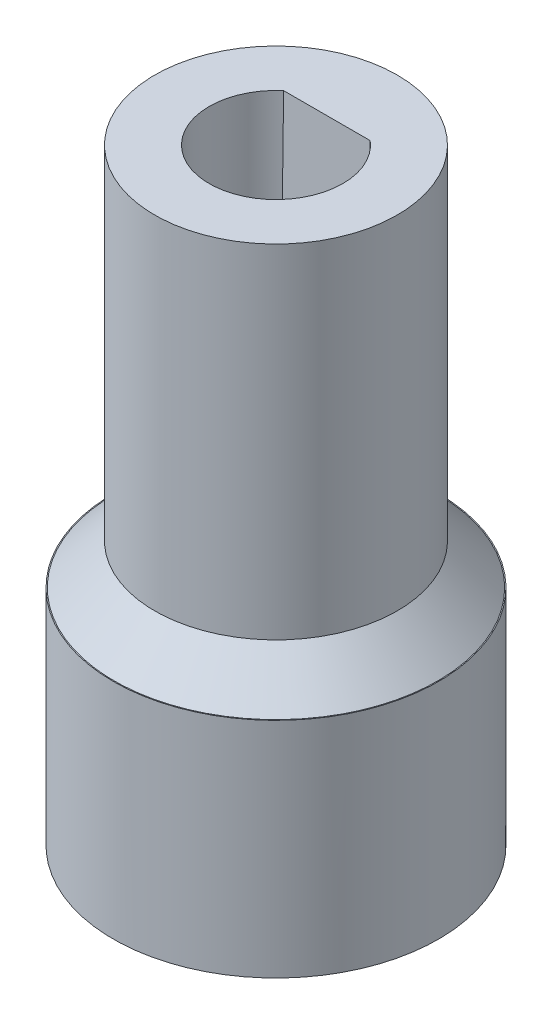
ISO-10303-21;
HEADER;
FILE_DESCRIPTION(('STEP AP214'),'2;1');
FILE_NAME('part.step','',(''),(''),'','','');
FILE_SCHEMA(('AUTOMOTIVE_DESIGN { 1 0 10303 214 1 1 1 1 }'));
ENDSEC;
DATA;
#1=APPLICATION_CONTEXT('core data for automotive mechanical design processes');
#2=APPLICATION_PROTOCOL_DEFINITION('international standard','automotive_design',2000,#1);
#3=PRODUCT_CONTEXT('',#1,'mechanical');
#4=PRODUCT('Part','Part','',(#3));
#5=PRODUCT_RELATED_PRODUCT_CATEGORY('part','',(#4));
#6=PRODUCT_DEFINITION_FORMATION('','',#4);
#7=PRODUCT_DEFINITION_CONTEXT('part definition',#1,'design');
#8=PRODUCT_DEFINITION('design','',#6,#7);
#9=PRODUCT_DEFINITION_SHAPE('','',#8);
#10=(LENGTH_UNIT() NAMED_UNIT(*) SI_UNIT(.MILLI.,.METRE.));
#11=(NAMED_UNIT(*) PLANE_ANGLE_UNIT() SI_UNIT($,.RADIAN.));
#12=(NAMED_UNIT(*) SI_UNIT($,.STERADIAN.) SOLID_ANGLE_UNIT());
#13=UNCERTAINTY_MEASURE_WITH_UNIT(LENGTH_MEASURE(1.E-05),#10,'distance_accuracy_value','');
#14=(GEOMETRIC_REPRESENTATION_CONTEXT(3) GLOBAL_UNCERTAINTY_ASSIGNED_CONTEXT((#13)) GLOBAL_UNIT_ASSIGNED_CONTEXT((#10,
#11,#12)) REPRESENTATION_CONTEXT('',''));
#15=CARTESIAN_POINT('',(0.,0.,0.));
#16=DIRECTION('',(0.,0.,1.));
#17=DIRECTION('',(1.,0.,0.));
#18=AXIS2_PLACEMENT_3D('',#15,#16,#17);
#19=CARTESIAN_POINT('',(0.,38.1,0.));
#20=DIRECTION('',(0.,-1.,0.));
#21=DIRECTION('',(0.,0.,-1.));
#22=AXIS2_PLACEMENT_3D('',#19,#20,#21);
#23=CYLINDRICAL_SURFACE('',#22,7.62);
#24=CARTESIAN_POINT('',(0.,16.5599999,0.));
#25=DIRECTION('',(0.,1.,0.));
#26=DIRECTION('',(0.,0.,1.));
#27=AXIS2_PLACEMENT_3D('',#24,#25,#26);
#28=CIRCLE('',#27,7.62);
#29=CARTESIAN_POINT('',(0.,16.5599999,-7.62));
#30=VERTEX_POINT('',#29);
#31=EDGE_CURVE('E12',#30,#30,#28,.T.);
#32=CARTESIAN_POINT('',(0.,38.1,0.));
#33=DIRECTION('',(0.,1.,0.));
#34=DIRECTION('',(0.,0.,1.));
#35=AXIS2_PLACEMENT_3D('',#32,#33,#34);
#36=CIRCLE('',#35,7.62);
#37=CARTESIAN_POINT('',(0.,38.1,-7.62));
#38=VERTEX_POINT('',#37);
#39=EDGE_CURVE('E143',#38,#38,#36,.T.);
#40=CARTESIAN_POINT('',(0.,16.5599999,-7.62));
#41=CARTESIAN_POINT('',(0.,16.7843749010416,-7.62));
#42=CARTESIAN_POINT('',(0.,17.0087499020833,-7.62));
#43=CARTESIAN_POINT('',(0.,17.4574999041666,-7.62));
#44=CARTESIAN_POINT('',(0.,17.6818749052083,-7.62));
#45=CARTESIAN_POINT('',(0.,18.1306249072916,-7.62));
#46=CARTESIAN_POINT('',(0.,18.3549999083333,-7.62));
#47=CARTESIAN_POINT('',(0.,18.8037499104166,-7.62));
#48=CARTESIAN_POINT('',(0.,19.0281249114583,-7.62));
#49=CARTESIAN_POINT('',(0.,19.4768749135416,-7.62));
#50=CARTESIAN_POINT('',(0.,19.7012499145833,-7.62));
#51=CARTESIAN_POINT('',(0.,20.1499999166667,-7.62));
#52=CARTESIAN_POINT('',(0.,20.3743749177083,-7.62));
#53=CARTESIAN_POINT('',(0.,20.8231249197917,-7.62));
#54=CARTESIAN_POINT('',(0.,21.0474999208333,-7.62));
#55=CARTESIAN_POINT('',(0.,21.4962499229167,-7.62));
#56=CARTESIAN_POINT('',(0.,21.7206249239583,-7.62));
#57=CARTESIAN_POINT('',(0.,22.1693749260417,-7.62));
#58=CARTESIAN_POINT('',(0.,22.3937499270833,-7.62));
#59=CARTESIAN_POINT('',(0.,22.8424999291667,-7.62));
#60=CARTESIAN_POINT('',(0.,23.0668749302083,-7.62));
#61=CARTESIAN_POINT('',(0.,23.5156249322917,-7.62));
#62=CARTESIAN_POINT('',(0.,23.7399999333333,-7.62));
#63=CARTESIAN_POINT('',(0.,24.1887499354167,-7.62));
#64=CARTESIAN_POINT('',(0.,24.4131249364583,-7.62));
#65=CARTESIAN_POINT('',(0.,24.8618749385417,-7.62));
#66=CARTESIAN_POINT('',(0.,25.0862499395833,-7.62));
#67=CARTESIAN_POINT('',(0.,25.5349999416667,-7.62));
#68=CARTESIAN_POINT('',(0.,25.7593749427083,-7.62));
#69=CARTESIAN_POINT('',(0.,26.2081249447917,-7.62));
#70=CARTESIAN_POINT('',(0.,26.4324999458333,-7.62));
#71=CARTESIAN_POINT('',(0.,26.8812499479167,-7.62));
#72=CARTESIAN_POINT('',(0.,27.1056249489583,-7.62));
#73=CARTESIAN_POINT('',(0.,27.5543749510417,-7.62));
#74=CARTESIAN_POINT('',(0.,27.7787499520833,-7.62));
#75=CARTESIAN_POINT('',(0.,28.2274999541667,-7.62));
#76=CARTESIAN_POINT('',(0.,28.4518749552083,-7.62));
#77=CARTESIAN_POINT('',(0.,28.9006249572917,-7.62));
#78=CARTESIAN_POINT('',(0.,29.1249999583333,-7.62));
#79=CARTESIAN_POINT('',(0.,29.5737499604167,-7.62));
#80=CARTESIAN_POINT('',(0.,29.7981249614583,-7.62));
#81=CARTESIAN_POINT('',(0.,30.2468749635417,-7.62));
#82=CARTESIAN_POINT('',(0.,30.4712499645833,-7.62));
#83=CARTESIAN_POINT('',(0.,30.9199999666667,-7.62));
#84=CARTESIAN_POINT('',(0.,31.1443749677083,-7.62));
#85=CARTESIAN_POINT('',(0.,31.5931249697917,-7.62));
#86=CARTESIAN_POINT('',(0.,31.8174999708333,-7.62));
#87=CARTESIAN_POINT('',(0.,32.2662499729167,-7.62));
#88=CARTESIAN_POINT('',(0.,32.4906249739583,-7.62));
#89=CARTESIAN_POINT('',(0.,32.9393749760417,-7.62));
#90=CARTESIAN_POINT('',(0.,33.1637499770833,-7.62));
#91=CARTESIAN_POINT('',(0.,33.6124999791667,-7.62));
#92=CARTESIAN_POINT('',(0.,33.8368749802083,-7.62));
#93=CARTESIAN_POINT('',(0.,34.2856249822917,-7.62));
#94=CARTESIAN_POINT('',(0.,34.5099999833333,-7.62));
#95=CARTESIAN_POINT('',(0.,34.9587499854167,-7.62));
#96=CARTESIAN_POINT('',(0.,35.1831249864583,-7.62));
#97=CARTESIAN_POINT('',(0.,35.6318749885417,-7.62));
#98=CARTESIAN_POINT('',(0.,35.8562499895833,-7.62));
#99=CARTESIAN_POINT('',(0.,36.3049999916667,-7.62));
#100=CARTESIAN_POINT('',(0.,36.5293749927083,-7.62));
#101=CARTESIAN_POINT('',(0.,36.9781249947917,-7.62));
#102=CARTESIAN_POINT('',(0.,37.2024999958333,-7.62));
#103=CARTESIAN_POINT('',(0.,37.6512499979167,-7.62));
#104=CARTESIAN_POINT('',(0.,37.8756249989583,-7.62));
#105=CARTESIAN_POINT('',(0.,38.1,-7.62));
#106=B_SPLINE_CURVE_WITH_KNOTS('',3,(#40,#41,#42,#43,#44,#45,#46,#47,#48,#49,#50,#51,#52,#53,
#54,#55,#56,#57,#58,#59,#60,#61,#62,#63,#64,#65,#66,#67,#68,#69,#70,#71,#72,#73,#74,#75,#76,#77,
#78,#79,#80,#81,#82,#83,#84,#85,#86,#87,#88,#89,#90,#91,#92,#93,#94,#95,#96,#97,#98,#99,#100,
#101,#102,#103,#104,#105),.UNSPECIFIED.,.F.,.F.,(4,2,2,2,2,2,2,2,2,2,2,2,2,2,2,2,2,2,2,2,2,2,2,
2,2,2,2,2,2,2,2,2,4),(0.,0.673125003125,1.34625000625,2.019375009375,2.6925000125,
3.36562501562501,4.03875001875,4.71187502187501,5.38500002500001,6.058125028125,
6.73125003125001,7.404375034375,8.07750003750001,8.75062504062501,9.42375004375001,
10.096875046875,10.77000005,11.443125053125,12.11625005625,12.789375059375,13.4625000625,
14.135625065625,14.80875006875,15.481875071875,16.155000075,16.828125078125,17.50125008125,
18.174375084375,18.8475000875,19.520625090625,20.19375009375,20.866875096875,21.5400001),.UNSPECIFIED.);
#107=EDGE_CURVE('BSEAM49',#30,#38,#106,.T.);
#108=ORIENTED_EDGE('',*,*,#31,.T.);
#109=ORIENTED_EDGE('',*,*,#39,.F.);
#110=ORIENTED_EDGE('',*,*,#107,.T.);
#111=ORIENTED_EDGE('',*,*,#107,.F.);
#112=EDGE_LOOP('',(#108,#110,#109,#111));
#113=FACE_BOUND('',#112,.T.);
#114=ADVANCED_FACE('F49',(#113),#23,.T.);
#115=CARTESIAN_POINT('',(0.,38.1,0.));
#116=DIRECTION('',(0.,1.,0.));
#117=DIRECTION('',(0.,0.,1.));
#118=AXIS2_PLACEMENT_3D('',#115,#116,#117);
#119=PLANE('',#118);
#120=CARTESIAN_POINT('',(0.,38.1,0.));
#121=DIRECTION('',(0.,1.,0.));
#122=DIRECTION('',(0.,0.,1.));
#123=AXIS2_PLACEMENT_3D('',#120,#121,#122);
#124=CIRCLE('',#123,4.1999996);
#125=CARTESIAN_POINT('',(-2.72029395470416,38.1,-3.1999996));
#126=VERTEX_POINT('',#125);
#127=CARTESIAN_POINT('',(2.72029395470416,38.1,-3.1999996));
#128=VERTEX_POINT('',#127);
#129=EDGE_CURVE('E65',#126,#128,#124,.T.);
#130=ORIENTED_EDGE('',*,*,#129,.F.);
#131=DIRECTION('',(-1.,0.,0.));
#132=VECTOR('',#131,1.);
#133=CARTESIAN_POINT('',(-2.72029395470416,38.1,-3.1999996));
#134=LINE('',#133,#132);
#135=EDGE_CURVE('E72',#128,#126,#134,.T.);
#136=ORIENTED_EDGE('',*,*,#135,.F.);
#137=EDGE_LOOP('',(#130,#136));
#138=FACE_BOUND('',#137,.T.);
#139=ORIENTED_EDGE('',*,*,#39,.T.);
#140=EDGE_LOOP('',(#139));
#141=FACE_BOUND('',#140,.T.);
#142=ADVANCED_FACE('F128',(#138,#141),#119,.T.);
#143=CARTESIAN_POINT('',(0.,19.0999999,0.));
#144=DIRECTION('',(0.,1.,0.));
#145=DIRECTION('',(0.,0.,1.));
#146=AXIS2_PLACEMENT_3D('',#143,#144,#145);
#147=PLANE('',#146);
#148=CARTESIAN_POINT('',(0.,19.0999999,0.));
#149=DIRECTION('',(0.,1.,0.));
#150=DIRECTION('',(0.,0.,1.));
#151=AXIS2_PLACEMENT_3D('',#148,#149,#150);
#152=CIRCLE('',#151,3.8);
#153=CARTESIAN_POINT('',(-2.56904651573303,19.0999999,-2.8));
#154=VERTEX_POINT('',#153);
#155=CARTESIAN_POINT('',(2.56904651573302,19.0999999,-2.8));
#156=VERTEX_POINT('',#155);
#157=EDGE_CURVE('E89',#154,#156,#152,.T.);
#158=ORIENTED_EDGE('',*,*,#157,.T.);
#159=DIRECTION('',(-1.,0.,0.));
#160=VECTOR('',#159,1.);
#161=CARTESIAN_POINT('',(-2.56904651573303,19.0999999,-2.8));
#162=LINE('',#161,#160);
#163=EDGE_CURVE('E80',#156,#154,#162,.T.);
#164=ORIENTED_EDGE('',*,*,#163,.T.);
#165=EDGE_LOOP('',(#158,#164));
#166=FACE_BOUND('',#165,.T.);
#167=ADVANCED_FACE('F88',(#166),#147,.T.);
#168=CARTESIAN_POINT('',(-2.56904651573302,19.0999999,-2.8));
#169=CARTESIAN_POINT('',(-2.72029395470416,38.1,-3.1999996));
#170=CARTESIAN_POINT('',(-5.59348121944187,19.0999999,-0.0250309151338395));
#171=CARTESIAN_POINT('',(-6.27458161375104,38.1,-0.178528212258318));
#172=CARTESIAN_POINT('',(-4.10458995503343,19.0999999,3.8));
#173=CARTESIAN_POINT('',(-4.66500269133841,38.1,4.1999996));
#174=CARTESIAN_POINT('',(4.10458995503343,19.0999999,3.8));
#175=CARTESIAN_POINT('',(4.66500269133841,38.1,4.1999996));
#176=CARTESIAN_POINT('',(5.59348121944187,19.0999999,-0.0250309151338399));
#177=CARTESIAN_POINT('',(6.27458161375104,38.1,-0.178528212258316));
#178=CARTESIAN_POINT('',(2.56904651573302,19.0999999,-2.8));
#179=CARTESIAN_POINT('',(2.72029395470416,38.1,-3.1999996));
#180=(BOUNDED_SURFACE() B_SPLINE_SURFACE(3,1,((#168,#169),(#170,#171),(#172,#173),(#174,#175),
(#176,#177),(#178,#179)),.UNSPECIFIED.,.F.,.F.,.F.) B_SPLINE_SURFACE_WITH_KNOTS((4,2,4),(2,2),
(0.,0.5,1.),(0.,1.),
.UNSPECIFIED.) GEOMETRIC_REPRESENTATION_ITEM() RATIONAL_B_SPLINE_SURFACE(((1.,1.),
(0.330807587743745,0.317369078438577),(0.190266878669339,0.178791519832698),(0.190266878669339,
0.178791519832698),(0.330807587743745,0.317369078438577),(1.,1.))) REPRESENTATION_ITEM('') SURFACE());
#181=DIRECTION('',(0.00795837596013004,-0.999746806074285,0.0210472800224349));
#182=VECTOR('',#181,1.);
#183=CARTESIAN_POINT('',(-2.64467023521859,28.59999995,-2.9999998));
#184=LINE('',#183,#182);
#185=EDGE_CURVE('E77',#126,#154,#184,.T.);
#186=DIRECTION('',(0.0079583759601301,0.999746806074285,-0.0210472800224348));
#187=VECTOR('',#186,1.);
#188=CARTESIAN_POINT('',(2.64467023521859,28.59999995,-2.9999998));
#189=LINE('',#188,#187);
#190=EDGE_CURVE('E84',#156,#128,#189,.T.);
#191=ORIENTED_EDGE('',*,*,#157,.F.);
#192=ORIENTED_EDGE('',*,*,#185,.F.);
#193=ORIENTED_EDGE('',*,*,#129,.T.);
#194=ORIENTED_EDGE('',*,*,#190,.F.);
#195=EDGE_LOOP('',(#191,#192,#193,#194));
#196=FACE_BOUND('',#195,.T.);
#197=ADVANCED_FACE('F95',(#196),#180,.F.);
#198=CARTESIAN_POINT('',(0.,-0.0504595879510395,-2.39683283712211));
#199=DIRECTION('',(0.,0.0210479465767086,0.999778467434113));
#200=DIRECTION('',(0.,-0.999778467434113,0.0210479465767086));
#201=AXIS2_PLACEMENT_3D('',#198,#199,#200);
#202=PLANE('',#201);
#203=ORIENTED_EDGE('',*,*,#185,.T.);
#204=ORIENTED_EDGE('',*,*,#163,.F.);
#205=ORIENTED_EDGE('',*,*,#190,.T.);
#206=ORIENTED_EDGE('',*,*,#135,.T.);
#207=EDGE_LOOP('',(#203,#204,#205,#206));
#208=FACE_BOUND('',#207,.T.);
#209=ADVANCED_FACE('F79',(#208),#202,.T.);
#210=CARTESIAN_POINT('',(0.,42.9210008196857,0.));
#211=DIRECTION('',(0.,-1.,0.));
#212=DIRECTION('',(0.,0.,-1.));
#213=AXIS2_PLACEMENT_3D('',#210,#211,#212);
#214=CYLINDRICAL_SURFACE('',#213,10.2180468666942);
#215=CARTESIAN_POINT('',(0.,0.,0.));
#216=DIRECTION('',(0.,-1.,0.));
#217=DIRECTION('',(0.,0.,-1.));
#218=AXIS2_PLACEMENT_3D('',#215,#216,#217);
#219=CIRCLE('',#218,10.2180468666942);
#220=CARTESIAN_POINT('',(0.,0.,-10.2180468666942));
#221=VERTEX_POINT('',#220);
#222=EDGE_CURVE('E196',#221,#221,#219,.T.);
#223=ORIENTED_EDGE('',*,*,#222,.F.);
#224=EDGE_LOOP('',(#223));
#225=FACE_BOUND('',#224,.T.);
#226=CARTESIAN_POINT('',(0.,14.0199999,0.));
#227=DIRECTION('',(0.,1.,0.));
#228=DIRECTION('',(0.,0.,1.));
#229=AXIS2_PLACEMENT_3D('',#226,#227,#228);
#230=CIRCLE('',#229,10.2180468666942);
#231=CARTESIAN_POINT('',(0.,14.0199999,10.2180468666942));
#232=VERTEX_POINT('',#231);
#233=EDGE_CURVE('E199',#232,#232,#230,.F.);
#234=ORIENTED_EDGE('',*,*,#233,.T.);
#235=EDGE_LOOP('',(#234));
#236=FACE_BOUND('',#235,.T.);
#237=ADVANCED_FACE('F127',(#225,#236),#214,.T.);
#238=CARTESIAN_POINT('',(0.,14.0199999,0.));
#239=DIRECTION('',(0.,1.,0.));
#240=DIRECTION('',(0.,0.,1.));
#241=AXIS2_PLACEMENT_3D('',#238,#239,#240);
#242=PLANE('',#241);
#243=CARTESIAN_POINT('',(0.,14.0199999,0.));
#244=DIRECTION('',(0.,1.,0.));
#245=DIRECTION('',(0.,0.,1.));
#246=AXIS2_PLACEMENT_3D('',#243,#244,#245);
#247=CIRCLE('',#246,10.16);
#248=CARTESIAN_POINT('',(0.,14.0199999,-10.16));
#249=VERTEX_POINT('',#248);
#250=EDGE_CURVE('E58',#249,#249,#247,.F.);
#251=ORIENTED_EDGE('',*,*,#250,.T.);
#252=EDGE_LOOP('',(#251));
#253=FACE_BOUND('',#252,.T.);
#254=ORIENTED_EDGE('',*,*,#233,.F.);
#255=EDGE_LOOP('',(#254));
#256=FACE_BOUND('',#255,.T.);
#257=ADVANCED_FACE('F222',(#253,#256),#242,.T.);
#258=CARTESIAN_POINT('',(0.,14.0199999,0.));
#259=DIRECTION('',(0.,1.,0.));
#260=DIRECTION('',(0.,0.,1.));
#261=AXIS2_PLACEMENT_3D('',#258,#259,#260);
#262=PLANE('',#261);
#263=CARTESIAN_POINT('',(0.,14.0199999,0.));
#264=DIRECTION('',(0.,1.,0.));
#265=DIRECTION('',(0.,0.,1.));
#266=AXIS2_PLACEMENT_3D('',#263,#264,#265);
#267=CIRCLE('',#266,6.096);
#268=CARTESIAN_POINT('',(0.,14.0199999,6.096));
#269=VERTEX_POINT('',#268);
#270=EDGE_CURVE('E198',#269,#269,#267,.T.);
#271=ORIENTED_EDGE('',*,*,#270,.F.);
#272=EDGE_LOOP('',(#271));
#273=FACE_BOUND('',#272,.T.);
#274=ADVANCED_FACE('F189',(#273),#262,.F.);
#275=CARTESIAN_POINT('',(0.,14.0199999,0.));
#276=DIRECTION('',(0.,-1.,0.));
#277=DIRECTION('',(0.,0.,-1.));
#278=AXIS2_PLACEMENT_3D('',#275,#276,#277);
#279=CONICAL_SURFACE('',#278,6.096,0.0252442835237943);
#280=ORIENTED_EDGE('',*,*,#270,.T.);
#281=EDGE_LOOP('',(#280));
#282=FACE_BOUND('',#281,.T.);
#283=CARTESIAN_POINT('',(0.,0.,0.));
#284=DIRECTION('',(0.,-1.,0.));
#285=DIRECTION('',(0.,0.,-1.));
#286=AXIS2_PLACEMENT_3D('',#283,#284,#285);
#287=CIRCLE('',#286,6.450000054);
#288=CARTESIAN_POINT('',(0.,0.,-6.450000054));
#289=VERTEX_POINT('',#288);
#290=EDGE_CURVE('E96',#289,#289,#287,.T.);
#291=ORIENTED_EDGE('',*,*,#290,.T.);
#292=EDGE_LOOP('',(#291));
#293=FACE_BOUND('',#292,.T.);
#294=ADVANCED_FACE('F181',(#282,#293),#279,.F.);
#295=CARTESIAN_POINT('',(0.,0.,0.));
#296=DIRECTION('',(0.,1.,0.));
#297=DIRECTION('',(0.,0.,1.));
#298=AXIS2_PLACEMENT_3D('',#295,#296,#297);
#299=PLANE('',#298);
#300=ORIENTED_EDGE('',*,*,#290,.F.);
#301=EDGE_LOOP('',(#300));
#302=FACE_BOUND('',#301,.T.);
#303=ORIENTED_EDGE('',*,*,#222,.T.);
#304=EDGE_LOOP('',(#303));
#305=FACE_BOUND('',#304,.T.);
#306=ADVANCED_FACE('F180',(#302,#305),#299,.F.);
#307=CARTESIAN_POINT('',(0.,14.0199999,0.));
#308=DIRECTION('',(0.,-1.,0.));
#309=DIRECTION('',(0.,0.,-1.));
#310=AXIS2_PLACEMENT_3D('',#307,#308,#309);
#311=CONICAL_SURFACE('',#310,10.16,0.785398163397453);
#312=CARTESIAN_POINT('',(0.,16.5599999,-7.62));
#313=CARTESIAN_POINT('',(0.,16.5335415666666,-7.64645833333333));
#314=CARTESIAN_POINT('',(0.,16.5070832333333,-7.67291666666666));
#315=CARTESIAN_POINT('',(0.,16.4541665666667,-7.72583333333333));
#316=CARTESIAN_POINT('',(0.,16.4277082333333,-7.75229166666666));
#317=CARTESIAN_POINT('',(0.,16.3747915666667,-7.80520833333333));
#318=CARTESIAN_POINT('',(0.,16.3483332333333,-7.83166666666666));
#319=CARTESIAN_POINT('',(0.,16.2954165666667,-7.88458333333333));
#320=CARTESIAN_POINT('',(0.,16.2689582333333,-7.91104166666666));
#321=CARTESIAN_POINT('',(0.,16.2160415666667,-7.96395833333333));
#322=CARTESIAN_POINT('',(0.,16.1895832333333,-7.99041666666666));
#323=CARTESIAN_POINT('',(0.,16.1366665666667,-8.04333333333333));
#324=CARTESIAN_POINT('',(0.,16.1102082333333,-8.06979166666666));
#325=CARTESIAN_POINT('',(0.,16.0572915666667,-8.12270833333333));
#326=CARTESIAN_POINT('',(0.,16.0308332333333,-8.14916666666666));
#327=CARTESIAN_POINT('',(0.,15.9779165666667,-8.20208333333333));
#328=CARTESIAN_POINT('',(0.,15.9514582333333,-8.22854166666666));
#329=CARTESIAN_POINT('',(0.,15.8985415666667,-8.28145833333333));
#330=CARTESIAN_POINT('',(0.,15.8720832333333,-8.30791666666667));
#331=CARTESIAN_POINT('',(0.,15.8191665666667,-8.36083333333333));
#332=CARTESIAN_POINT('',(0.,15.7927082333333,-8.38729166666666));
#333=CARTESIAN_POINT('',(0.,15.7397915666667,-8.44020833333333));
#334=CARTESIAN_POINT('',(0.,15.7133332333333,-8.46666666666666));
#335=CARTESIAN_POINT('',(0.,15.6604165666667,-8.51958333333333));
#336=CARTESIAN_POINT('',(0.,15.6339582333333,-8.54604166666667));
#337=CARTESIAN_POINT('',(0.,15.5810415666667,-8.59895833333333));
#338=CARTESIAN_POINT('',(0.,15.5545832333333,-8.62541666666666));
#339=CARTESIAN_POINT('',(0.,15.5016665666667,-8.67833333333333));
#340=CARTESIAN_POINT('',(0.,15.4752082333333,-8.70479166666667));
#341=CARTESIAN_POINT('',(0.,15.4222915666667,-8.75770833333333));
#342=CARTESIAN_POINT('',(0.,15.3958332333333,-8.78416666666667));
#343=CARTESIAN_POINT('',(0.,15.3429165666667,-8.83708333333333));
#344=CARTESIAN_POINT('',(0.,15.3164582333333,-8.86354166666666));
#345=CARTESIAN_POINT('',(0.,15.2635415666667,-8.91645833333333));
#346=CARTESIAN_POINT('',(0.,15.2370832333333,-8.94291666666667));
#347=CARTESIAN_POINT('',(0.,15.1841665666667,-8.99583333333333));
#348=CARTESIAN_POINT('',(0.,15.1577082333333,-9.02229166666666));
#349=CARTESIAN_POINT('',(0.,15.1047915666667,-9.07520833333333));
#350=CARTESIAN_POINT('',(0.,15.0783332333333,-9.10166666666667));
#351=CARTESIAN_POINT('',(0.,15.0254165666667,-9.15458333333333));
#352=CARTESIAN_POINT('',(0.,14.9989582333333,-9.18104166666667));
#353=CARTESIAN_POINT('',(0.,14.9460415666667,-9.23395833333333));
#354=CARTESIAN_POINT('',(0.,14.9195832333333,-9.26041666666666));
#355=CARTESIAN_POINT('',(0.,14.8666665666667,-9.31333333333333));
#356=CARTESIAN_POINT('',(0.,14.8402082333333,-9.33979166666667));
#357=CARTESIAN_POINT('',(0.,14.7872915666667,-9.39270833333333));
#358=CARTESIAN_POINT('',(0.,14.7608332333333,-9.41916666666667));
#359=CARTESIAN_POINT('',(0.,14.7079165666667,-9.47208333333333));
#360=CARTESIAN_POINT('',(0.,14.6814582333333,-9.49854166666667));
#361=CARTESIAN_POINT('',(0.,14.6285415666667,-9.55145833333333));
#362=CARTESIAN_POINT('',(0.,14.6020832333333,-9.57791666666667));
#363=CARTESIAN_POINT('',(0.,14.5491665666667,-9.63083333333333));
#364=CARTESIAN_POINT('',(0.,14.5227082333333,-9.65729166666667));
#365=CARTESIAN_POINT('',(0.,14.4697915666667,-9.71020833333333));
#366=CARTESIAN_POINT('',(0.,14.4433332333333,-9.73666666666667));
#367=CARTESIAN_POINT('',(0.,14.3904165666667,-9.78958333333333));
#368=CARTESIAN_POINT('',(0.,14.3639582333333,-9.81604166666667));
#369=CARTESIAN_POINT('',(0.,14.3110415666667,-9.86895833333333));
#370=CARTESIAN_POINT('',(0.,14.2845832333333,-9.89541666666667));
#371=CARTESIAN_POINT('',(0.,14.2316665666667,-9.94833333333333));
#372=CARTESIAN_POINT('',(0.,14.2052082333333,-9.97479166666667));
#373=CARTESIAN_POINT('',(0.,14.1522915666667,-10.0277083333333));
#374=CARTESIAN_POINT('',(0.,14.1258332333333,-10.0541666666667));
#375=CARTESIAN_POINT('',(0.,14.0729165666667,-10.1070833333333));
#376=CARTESIAN_POINT('',(0.,14.0464582333333,-10.1335416666667));
#377=CARTESIAN_POINT('',(0.,14.0199999,-10.16));
#378=B_SPLINE_CURVE_WITH_KNOTS('',3,(#312,#313,#314,#315,#316,#317,#318,#319,#320,#321,#322,
#323,#324,#325,#326,#327,#328,#329,#330,#331,#332,#333,#334,#335,#336,#337,#338,#339,#340,#341,
#342,#343,#344,#345,#346,#347,#348,#349,#350,#351,#352,#353,#354,#355,#356,#357,#358,#359,#360,
#361,#362,#363,#364,#365,#366,#367,#368,#369,#370,#371,#372,#373,#374,#375,#376,#377),
.UNSPECIFIED.,.F.,.F.,(4,2,2,2,2,2,2,2,2,2,2,2,2,2,2,2,2,2,2,2,2,2,2,2,2,2,2,2,2,2,2,2,4),(0.,
0.112253201513362,0.224506403026726,0.33675960454009,0.449012806053454,0.561266007566819,
0.673519209080183,0.785772410593547,0.898025612106912,1.01027881362028,1.12253201513364,
1.234785216647,1.34703841816037,1.45929161967373,1.57154482118709,1.68379802270046,
1.79605122421382,1.90830442572719,2.02055762724055,2.13281082875391,2.24506403026728,
2.35731723178064,2.46957043329401,2.58182363480737,2.69407683632074,2.8063300378341,
2.91858323934746,3.03083644086083,3.14308964237419,3.25534284388756,3.36759604540092,
3.47984924691428,3.59210244842765),.UNSPECIFIED.);
#379=EDGE_CURVE('BSEAM52',#30,#249,#378,.T.);
#380=ORIENTED_EDGE('',*,*,#31,.F.);
#381=ORIENTED_EDGE('',*,*,#250,.F.);
#382=ORIENTED_EDGE('',*,*,#379,.T.);
#383=ORIENTED_EDGE('',*,*,#379,.F.);
#384=EDGE_LOOP('',(#380,#382,#381,#383));
#385=FACE_BOUND('',#384,.T.);
#386=ADVANCED_FACE('F52',(#385),#311,.T.);
#387=CLOSED_SHELL('',(#114,#142,#167,#197,#209,#237,#257,#274,#294,#306,#386));
#388=MANIFOLD_SOLID_BREP('B2',#387);
#389=ADVANCED_BREP_SHAPE_REPRESENTATION('',(#18,#388),#14);
#390=SHAPE_DEFINITION_REPRESENTATION(#9,#389);
ENDSEC;
END-ISO-10303-21;
